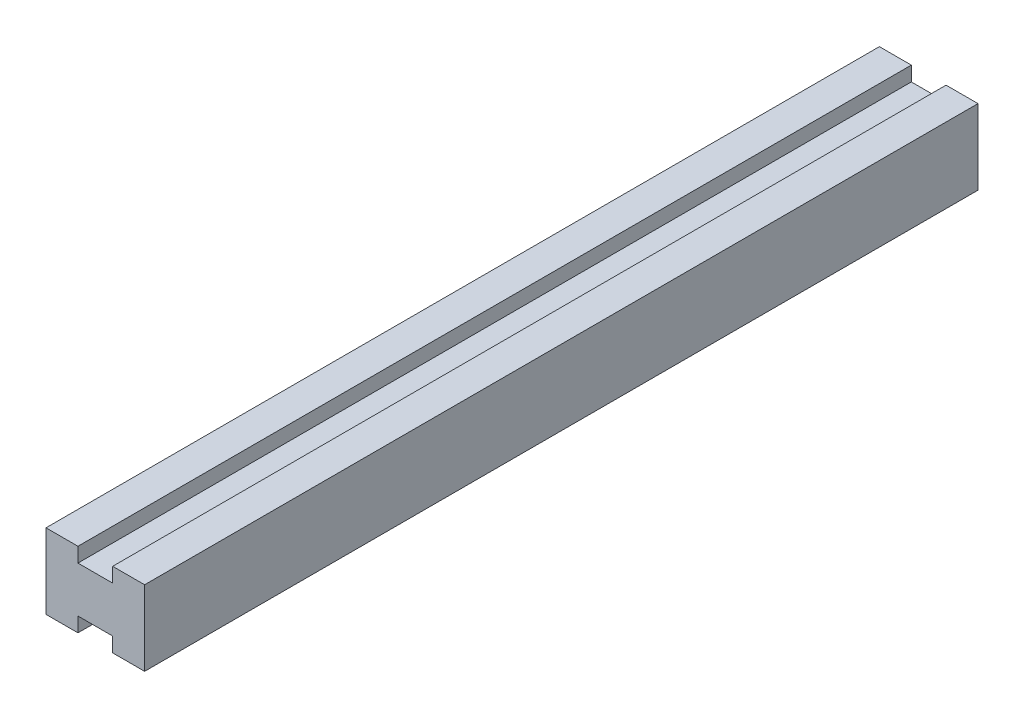
ISO-10303-21;
HEADER;
FILE_DESCRIPTION(('STEP AP214'),'2;1');
FILE_NAME('part.step','',(''),(''),'','','');
FILE_SCHEMA(('AUTOMOTIVE_DESIGN { 1 0 10303 214 1 1 1 1 }'));
ENDSEC;
DATA;
#1=APPLICATION_CONTEXT('core data for automotive mechanical design processes');
#2=APPLICATION_PROTOCOL_DEFINITION('international standard','automotive_design',2000,#1);
#3=PRODUCT_CONTEXT('',#1,'mechanical');
#4=PRODUCT('Part','Part','',(#3));
#5=PRODUCT_RELATED_PRODUCT_CATEGORY('part','',(#4));
#6=PRODUCT_DEFINITION_FORMATION('','',#4);
#7=PRODUCT_DEFINITION_CONTEXT('part definition',#1,'design');
#8=PRODUCT_DEFINITION('design','',#6,#7);
#9=PRODUCT_DEFINITION_SHAPE('','',#8);
#10=(LENGTH_UNIT() NAMED_UNIT(*) SI_UNIT(.MILLI.,.METRE.));
#11=(NAMED_UNIT(*) PLANE_ANGLE_UNIT() SI_UNIT($,.RADIAN.));
#12=(NAMED_UNIT(*) SI_UNIT($,.STERADIAN.) SOLID_ANGLE_UNIT());
#13=UNCERTAINTY_MEASURE_WITH_UNIT(LENGTH_MEASURE(1.E-05),#10,'distance_accuracy_value','');
#14=(GEOMETRIC_REPRESENTATION_CONTEXT(3) GLOBAL_UNCERTAINTY_ASSIGNED_CONTEXT((#13)) GLOBAL_UNIT_ASSIGNED_CONTEXT((#10,
#11,#12)) REPRESENTATION_CONTEXT('',''));
#15=CARTESIAN_POINT('',(0.,0.,0.));
#16=DIRECTION('',(0.,0.,1.));
#17=DIRECTION('',(1.,0.,0.));
#18=AXIS2_PLACEMENT_3D('',#15,#16,#17);
#19=CARTESIAN_POINT('',(-1.30000000000003,2.75,60.));
#20=DIRECTION('',(1.,0.,0.));
#21=DIRECTION('',(0.,0.,-1.));
#22=AXIS2_PLACEMENT_3D('',#19,#20,#21);
#23=PLANE('',#22);
#24=DIRECTION('',(0.,-1.,0.));
#25=VECTOR('',#24,1.);
#26=CARTESIAN_POINT('',(-1.30000000000003,2.75,0.));
#27=LINE('',#26,#25);
#28=CARTESIAN_POINT('',(-1.30000000000003,2.75,0.));
#29=VERTEX_POINT('',#28);
#30=CARTESIAN_POINT('',(-1.30000000000003,1.70000000000001,0.));
#31=VERTEX_POINT('',#30);
#32=EDGE_CURVE('E155',#29,#31,#27,.T.);
#33=ORIENTED_EDGE('',*,*,#32,.F.);
#34=DIRECTION('',(0.,0.,-1.));
#35=VECTOR('',#34,1.);
#36=CARTESIAN_POINT('',(-1.30000000000003,2.75,60.));
#37=LINE('',#36,#35);
#38=CARTESIAN_POINT('',(-1.30000000000003,2.75,60.));
#39=VERTEX_POINT('',#38);
#40=EDGE_CURVE('E11',#39,#29,#37,.T.);
#41=ORIENTED_EDGE('',*,*,#40,.F.);
#42=DIRECTION('',(0.,-1.,0.));
#43=VECTOR('',#42,1.);
#44=CARTESIAN_POINT('',(-1.30000000000003,2.75,60.));
#45=LINE('',#44,#43);
#46=CARTESIAN_POINT('',(-1.30000000000003,1.70000000000001,60.));
#47=VERTEX_POINT('',#46);
#48=EDGE_CURVE('E183',#39,#47,#45,.T.);
#49=ORIENTED_EDGE('',*,*,#48,.T.);
#50=DIRECTION('',(0.,0.,-1.));
#51=VECTOR('',#50,1.);
#52=CARTESIAN_POINT('',(-1.30000000000003,1.70000000000001,60.));
#53=LINE('',#52,#51);
#54=EDGE_CURVE('E36',#47,#31,#53,.T.);
#55=ORIENTED_EDGE('',*,*,#54,.T.);
#56=EDGE_LOOP('',(#33,#41,#49,#55));
#57=FACE_BOUND('',#56,.T.);
#58=ADVANCED_FACE('F33',(#57),#23,.T.);
#59=CARTESIAN_POINT('',(-1.30000000000003,2.75,60.));
#60=DIRECTION('',(0.,-1.,0.));
#61=DIRECTION('',(1.,0.,0.));
#62=AXIS2_PLACEMENT_3D('',#59,#60,#61);
#63=PLANE('',#62);
#64=DIRECTION('',(-1.,0.,0.));
#65=VECTOR('',#64,1.);
#66=CARTESIAN_POINT('',(-1.30000000000003,2.75,0.));
#67=LINE('',#66,#65);
#68=CARTESIAN_POINT('',(-3.60000000000001,2.75,0.));
#69=VERTEX_POINT('',#68);
#70=EDGE_CURVE('E90',#29,#69,#67,.T.);
#71=ORIENTED_EDGE('',*,*,#70,.T.);
#72=DIRECTION('',(0.,0.,-1.));
#73=VECTOR('',#72,1.);
#74=CARTESIAN_POINT('',(-3.60000000000001,2.75,60.));
#75=LINE('',#74,#73);
#76=CARTESIAN_POINT('',(-3.60000000000001,2.75,60.));
#77=VERTEX_POINT('',#76);
#78=EDGE_CURVE('E42',#77,#69,#75,.T.);
#79=ORIENTED_EDGE('',*,*,#78,.F.);
#80=DIRECTION('',(-1.,0.,0.));
#81=VECTOR('',#80,1.);
#82=CARTESIAN_POINT('',(-1.30000000000003,2.75,60.));
#83=LINE('',#82,#81);
#84=EDGE_CURVE('E134',#39,#77,#83,.T.);
#85=ORIENTED_EDGE('',*,*,#84,.F.);
#86=ORIENTED_EDGE('',*,*,#40,.T.);
#87=EDGE_LOOP('',(#71,#79,#85,#86));
#88=FACE_BOUND('',#87,.T.);
#89=ADVANCED_FACE('F260',(#88),#63,.F.);
#90=CARTESIAN_POINT('',(-3.60000000000001,2.75,60.));
#91=DIRECTION('',(1.,0.,0.));
#92=DIRECTION('',(0.,0.,-1.));
#93=AXIS2_PLACEMENT_3D('',#90,#91,#92);
#94=PLANE('',#93);
#95=DIRECTION('',(0.,-1.,0.));
#96=VECTOR('',#95,1.);
#97=CARTESIAN_POINT('',(-3.60000000000001,2.75,0.));
#98=LINE('',#97,#96);
#99=CARTESIAN_POINT('',(-3.60000000000001,-2.65,0.));
#100=VERTEX_POINT('',#99);
#101=EDGE_CURVE('E141',#69,#100,#98,.T.);
#102=ORIENTED_EDGE('',*,*,#101,.T.);
#103=DIRECTION('',(0.,0.,-1.));
#104=VECTOR('',#103,1.);
#105=CARTESIAN_POINT('',(-3.60000000000001,-2.65,60.));
#106=LINE('',#105,#104);
#107=CARTESIAN_POINT('',(-3.60000000000001,-2.65,60.));
#108=VERTEX_POINT('',#107);
#109=EDGE_CURVE('E138',#108,#100,#106,.T.);
#110=ORIENTED_EDGE('',*,*,#109,.F.);
#111=DIRECTION('',(0.,-1.,0.));
#112=VECTOR('',#111,1.);
#113=CARTESIAN_POINT('',(-3.60000000000001,2.75,60.));
#114=LINE('',#113,#112);
#115=EDGE_CURVE('E127',#77,#108,#114,.T.);
#116=ORIENTED_EDGE('',*,*,#115,.F.);
#117=ORIENTED_EDGE('',*,*,#78,.T.);
#118=EDGE_LOOP('',(#102,#110,#116,#117));
#119=FACE_BOUND('',#118,.T.);
#120=ADVANCED_FACE('F139',(#119),#94,.F.);
#121=CARTESIAN_POINT('',(-1.30000000000003,-2.65,60.));
#122=DIRECTION('',(0.,-1.,0.));
#123=DIRECTION('',(1.,0.,0.));
#124=AXIS2_PLACEMENT_3D('',#121,#122,#123);
#125=PLANE('',#124);
#126=DIRECTION('',(-1.,0.,0.));
#127=VECTOR('',#126,1.);
#128=CARTESIAN_POINT('',(-1.30000000000003,-2.65,0.));
#129=LINE('',#128,#127);
#130=CARTESIAN_POINT('',(-1.30000000000003,-2.65,0.));
#131=VERTEX_POINT('',#130);
#132=EDGE_CURVE('E180',#131,#100,#129,.T.);
#133=ORIENTED_EDGE('',*,*,#132,.F.);
#134=DIRECTION('',(0.,0.,-1.));
#135=VECTOR('',#134,1.);
#136=CARTESIAN_POINT('',(-1.30000000000003,-2.65,60.));
#137=LINE('',#136,#135);
#138=CARTESIAN_POINT('',(-1.30000000000003,-2.65,60.));
#139=VERTEX_POINT('',#138);
#140=EDGE_CURVE('E145',#139,#131,#137,.T.);
#141=ORIENTED_EDGE('',*,*,#140,.F.);
#142=DIRECTION('',(-1.,0.,0.));
#143=VECTOR('',#142,1.);
#144=CARTESIAN_POINT('',(-1.30000000000003,-2.65,60.));
#145=LINE('',#144,#143);
#146=EDGE_CURVE('E132',#139,#108,#145,.T.);
#147=ORIENTED_EDGE('',*,*,#146,.T.);
#148=ORIENTED_EDGE('',*,*,#109,.T.);
#149=EDGE_LOOP('',(#133,#141,#147,#148));
#150=FACE_BOUND('',#149,.T.);
#151=ADVANCED_FACE('F147',(#150),#125,.T.);
#152=CARTESIAN_POINT('',(-1.30000000000003,-1.6,60.));
#153=DIRECTION('',(1.,0.,0.));
#154=DIRECTION('',(0.,1.,0.));
#155=AXIS2_PLACEMENT_3D('',#152,#153,#154);
#156=PLANE('',#155);
#157=DIRECTION('',(0.,-1.,0.));
#158=VECTOR('',#157,1.);
#159=CARTESIAN_POINT('',(-1.30000000000003,-1.6,0.));
#160=LINE('',#159,#158);
#161=CARTESIAN_POINT('',(-1.30000000000003,-1.6,0.));
#162=VERTEX_POINT('',#161);
#163=EDGE_CURVE('E177',#162,#131,#160,.T.);
#164=ORIENTED_EDGE('',*,*,#163,.F.);
#165=DIRECTION('',(0.,0.,-1.));
#166=VECTOR('',#165,1.);
#167=CARTESIAN_POINT('',(-1.30000000000003,-1.6,60.));
#168=LINE('',#167,#166);
#169=CARTESIAN_POINT('',(-1.30000000000003,-1.6,60.));
#170=VERTEX_POINT('',#169);
#171=EDGE_CURVE('E187',#170,#162,#168,.T.);
#172=ORIENTED_EDGE('',*,*,#171,.F.);
#173=DIRECTION('',(0.,-1.,0.));
#174=VECTOR('',#173,1.);
#175=CARTESIAN_POINT('',(-1.30000000000003,-1.6,60.));
#176=LINE('',#175,#174);
#177=EDGE_CURVE('E148',#170,#139,#176,.T.);
#178=ORIENTED_EDGE('',*,*,#177,.T.);
#179=ORIENTED_EDGE('',*,*,#140,.T.);
#180=EDGE_LOOP('',(#164,#172,#178,#179));
#181=FACE_BOUND('',#180,.T.);
#182=ADVANCED_FACE('F212',(#181),#156,.T.);
#183=CARTESIAN_POINT('',(1.19999999999997,-1.60000000000001,60.));
#184=DIRECTION('',(0.,-1.,0.));
#185=DIRECTION('',(1.,0.,0.));
#186=AXIS2_PLACEMENT_3D('',#183,#184,#185);
#187=PLANE('',#186);
#188=DIRECTION('',(-1.,0.,0.));
#189=VECTOR('',#188,1.);
#190=CARTESIAN_POINT('',(1.19999999999997,-1.60000000000001,0.));
#191=LINE('',#190,#189);
#192=CARTESIAN_POINT('',(1.19999999999997,-1.60000000000001,0.));
#193=VERTEX_POINT('',#192);
#194=EDGE_CURVE('E174',#193,#162,#191,.T.);
#195=ORIENTED_EDGE('',*,*,#194,.F.);
#196=DIRECTION('',(0.,0.,-1.));
#197=VECTOR('',#196,1.);
#198=CARTESIAN_POINT('',(1.19999999999997,-1.60000000000001,60.));
#199=LINE('',#198,#197);
#200=CARTESIAN_POINT('',(1.19999999999997,-1.60000000000001,60.));
#201=VERTEX_POINT('',#200);
#202=EDGE_CURVE('E189',#201,#193,#199,.T.);
#203=ORIENTED_EDGE('',*,*,#202,.F.);
#204=DIRECTION('',(-1.,0.,0.));
#205=VECTOR('',#204,1.);
#206=CARTESIAN_POINT('',(1.19999999999997,-1.60000000000001,60.));
#207=LINE('',#206,#205);
#208=EDGE_CURVE('E150',#201,#170,#207,.T.);
#209=ORIENTED_EDGE('',*,*,#208,.T.);
#210=ORIENTED_EDGE('',*,*,#171,.T.);
#211=EDGE_LOOP('',(#195,#203,#209,#210));
#212=FACE_BOUND('',#211,.T.);
#213=ADVANCED_FACE('F216',(#212),#187,.T.);
#214=CARTESIAN_POINT('',(1.19999999999997,-1.60000000000001,60.));
#215=DIRECTION('',(1.,0.,0.));
#216=DIRECTION('',(0.,0.,-1.));
#217=AXIS2_PLACEMENT_3D('',#214,#215,#216);
#218=PLANE('',#217);
#219=DIRECTION('',(0.,-1.,0.));
#220=VECTOR('',#219,1.);
#221=CARTESIAN_POINT('',(1.19999999999997,-1.60000000000001,0.));
#222=LINE('',#221,#220);
#223=CARTESIAN_POINT('',(1.19999999999997,-2.65,0.));
#224=VERTEX_POINT('',#223);
#225=EDGE_CURVE('E172',#193,#224,#222,.T.);
#226=ORIENTED_EDGE('',*,*,#225,.T.);
#227=DIRECTION('',(0.,0.,-1.));
#228=VECTOR('',#227,1.);
#229=CARTESIAN_POINT('',(1.19999999999997,-2.65,60.));
#230=LINE('',#229,#228);
#231=CARTESIAN_POINT('',(1.19999999999997,-2.65,60.));
#232=VERTEX_POINT('',#231);
#233=EDGE_CURVE('E191',#232,#224,#230,.T.);
#234=ORIENTED_EDGE('',*,*,#233,.F.);
#235=DIRECTION('',(0.,-1.,0.));
#236=VECTOR('',#235,1.);
#237=CARTESIAN_POINT('',(1.19999999999997,-1.60000000000001,60.));
#238=LINE('',#237,#236);
#239=EDGE_CURVE('E218',#201,#232,#238,.T.);
#240=ORIENTED_EDGE('',*,*,#239,.F.);
#241=ORIENTED_EDGE('',*,*,#202,.T.);
#242=EDGE_LOOP('',(#226,#234,#240,#241));
#243=FACE_BOUND('',#242,.T.);
#244=ADVANCED_FACE('F250',(#243),#218,.F.);
#245=CARTESIAN_POINT('',(1.19999999999997,-2.65,60.));
#246=DIRECTION('',(0.,1.,0.));
#247=DIRECTION('',(0.,0.,1.));
#248=AXIS2_PLACEMENT_3D('',#245,#246,#247);
#249=PLANE('',#248);
#250=DIRECTION('',(1.,0.,0.));
#251=VECTOR('',#250,1.);
#252=CARTESIAN_POINT('',(1.19999999999997,-2.65,0.));
#253=LINE('',#252,#251);
#254=CARTESIAN_POINT('',(3.49999999999996,-2.65,0.));
#255=VERTEX_POINT('',#254);
#256=EDGE_CURVE('E169',#224,#255,#253,.T.);
#257=ORIENTED_EDGE('',*,*,#256,.T.);
#258=DIRECTION('',(0.,0.,-1.));
#259=VECTOR('',#258,1.);
#260=CARTESIAN_POINT('',(3.49999999999996,-2.65,60.));
#261=LINE('',#260,#259);
#262=CARTESIAN_POINT('',(3.49999999999996,-2.65,60.));
#263=VERTEX_POINT('',#262);
#264=EDGE_CURVE('E194',#263,#255,#261,.T.);
#265=ORIENTED_EDGE('',*,*,#264,.F.);
#266=DIRECTION('',(1.,0.,0.));
#267=VECTOR('',#266,1.);
#268=CARTESIAN_POINT('',(1.19999999999997,-2.65,60.));
#269=LINE('',#268,#267);
#270=EDGE_CURVE('E219',#232,#263,#269,.T.);
#271=ORIENTED_EDGE('',*,*,#270,.F.);
#272=ORIENTED_EDGE('',*,*,#233,.T.);
#273=EDGE_LOOP('',(#257,#265,#271,#272));
#274=FACE_BOUND('',#273,.T.);
#275=ADVANCED_FACE('F246',(#274),#249,.F.);
#276=CARTESIAN_POINT('',(3.49999999999996,2.75,60.));
#277=DIRECTION('',(1.,0.,0.));
#278=DIRECTION('',(0.,1.,0.));
#279=AXIS2_PLACEMENT_3D('',#276,#277,#278);
#280=PLANE('',#279);
#281=DIRECTION('',(0.,-1.,0.));
#282=VECTOR('',#281,1.);
#283=CARTESIAN_POINT('',(3.49999999999996,2.75,0.));
#284=LINE('',#283,#282);
#285=CARTESIAN_POINT('',(3.49999999999996,2.75,0.));
#286=VERTEX_POINT('',#285);
#287=EDGE_CURVE('E166',#286,#255,#284,.T.);
#288=ORIENTED_EDGE('',*,*,#287,.F.);
#289=DIRECTION('',(0.,0.,-1.));
#290=VECTOR('',#289,1.);
#291=CARTESIAN_POINT('',(3.49999999999996,2.75,60.));
#292=LINE('',#291,#290);
#293=CARTESIAN_POINT('',(3.49999999999996,2.75,60.));
#294=VERTEX_POINT('',#293);
#295=EDGE_CURVE('E196',#294,#286,#292,.T.);
#296=ORIENTED_EDGE('',*,*,#295,.F.);
#297=DIRECTION('',(0.,-1.,0.));
#298=VECTOR('',#297,1.);
#299=CARTESIAN_POINT('',(3.49999999999996,2.75,60.));
#300=LINE('',#299,#298);
#301=EDGE_CURVE('E223',#294,#263,#300,.T.);
#302=ORIENTED_EDGE('',*,*,#301,.T.);
#303=ORIENTED_EDGE('',*,*,#264,.T.);
#304=EDGE_LOOP('',(#288,#296,#302,#303));
#305=FACE_BOUND('',#304,.T.);
#306=ADVANCED_FACE('F242',(#305),#280,.T.);
#307=CARTESIAN_POINT('',(1.19999999999997,2.75,60.));
#308=DIRECTION('',(0.,1.,0.));
#309=DIRECTION('',(-1.,0.,0.));
#310=AXIS2_PLACEMENT_3D('',#307,#308,#309);
#311=PLANE('',#310);
#312=DIRECTION('',(1.,0.,0.));
#313=VECTOR('',#312,1.);
#314=CARTESIAN_POINT('',(1.19999999999997,2.75,0.));
#315=LINE('',#314,#313);
#316=CARTESIAN_POINT('',(1.19999999999997,2.75,0.));
#317=VERTEX_POINT('',#316);
#318=EDGE_CURVE('E163',#317,#286,#315,.T.);
#319=ORIENTED_EDGE('',*,*,#318,.F.);
#320=DIRECTION('',(0.,0.,-1.));
#321=VECTOR('',#320,1.);
#322=CARTESIAN_POINT('',(1.19999999999997,2.75,60.));
#323=LINE('',#322,#321);
#324=CARTESIAN_POINT('',(1.19999999999997,2.75,60.));
#325=VERTEX_POINT('',#324);
#326=EDGE_CURVE('E198',#325,#317,#323,.T.);
#327=ORIENTED_EDGE('',*,*,#326,.F.);
#328=DIRECTION('',(1.,0.,0.));
#329=VECTOR('',#328,1.);
#330=CARTESIAN_POINT('',(1.19999999999997,2.75,60.));
#331=LINE('',#330,#329);
#332=EDGE_CURVE('E226',#325,#294,#331,.T.);
#333=ORIENTED_EDGE('',*,*,#332,.T.);
#334=ORIENTED_EDGE('',*,*,#295,.T.);
#335=EDGE_LOOP('',(#319,#327,#333,#334));
#336=FACE_BOUND('',#335,.T.);
#337=ADVANCED_FACE('F239',(#336),#311,.T.);
#338=CARTESIAN_POINT('',(1.19999999999997,2.75,60.));
#339=DIRECTION('',(1.,0.,0.));
#340=DIRECTION('',(0.,1.,0.));
#341=AXIS2_PLACEMENT_3D('',#338,#339,#340);
#342=PLANE('',#341);
#343=DIRECTION('',(0.,-1.,0.));
#344=VECTOR('',#343,1.);
#345=CARTESIAN_POINT('',(1.19999999999997,2.75,0.));
#346=LINE('',#345,#344);
#347=CARTESIAN_POINT('',(1.19999999999997,1.70000000000001,0.));
#348=VERTEX_POINT('',#347);
#349=EDGE_CURVE('E161',#317,#348,#346,.T.);
#350=ORIENTED_EDGE('',*,*,#349,.T.);
#351=DIRECTION('',(0.,0.,-1.));
#352=VECTOR('',#351,1.);
#353=CARTESIAN_POINT('',(1.19999999999997,1.70000000000001,60.));
#354=LINE('',#353,#352);
#355=CARTESIAN_POINT('',(1.19999999999997,1.70000000000001,60.));
#356=VERTEX_POINT('',#355);
#357=EDGE_CURVE('E199',#356,#348,#354,.T.);
#358=ORIENTED_EDGE('',*,*,#357,.F.);
#359=DIRECTION('',(0.,-1.,0.));
#360=VECTOR('',#359,1.);
#361=CARTESIAN_POINT('',(1.19999999999997,2.75,60.));
#362=LINE('',#361,#360);
#363=EDGE_CURVE('E229',#325,#356,#362,.T.);
#364=ORIENTED_EDGE('',*,*,#363,.F.);
#365=ORIENTED_EDGE('',*,*,#326,.T.);
#366=EDGE_LOOP('',(#350,#358,#364,#365));
#367=FACE_BOUND('',#366,.T.);
#368=ADVANCED_FACE('F236',(#367),#342,.F.);
#369=CARTESIAN_POINT('',(1.19999999999997,1.70000000000001,60.));
#370=DIRECTION('',(0.,-1.,0.));
#371=DIRECTION('',(1.,0.,0.));
#372=AXIS2_PLACEMENT_3D('',#369,#370,#371);
#373=PLANE('',#372);
#374=DIRECTION('',(-1.,0.,0.));
#375=VECTOR('',#374,1.);
#376=CARTESIAN_POINT('',(1.19999999999997,1.70000000000001,0.));
#377=LINE('',#376,#375);
#378=EDGE_CURVE('E158',#348,#31,#377,.T.);
#379=ORIENTED_EDGE('',*,*,#378,.T.);
#380=ORIENTED_EDGE('',*,*,#54,.F.);
#381=DIRECTION('',(-1.,0.,0.));
#382=VECTOR('',#381,1.);
#383=CARTESIAN_POINT('',(1.19999999999997,1.70000000000001,60.));
#384=LINE('',#383,#382);
#385=EDGE_CURVE('E100',#356,#47,#384,.T.);
#386=ORIENTED_EDGE('',*,*,#385,.F.);
#387=ORIENTED_EDGE('',*,*,#357,.T.);
#388=EDGE_LOOP('',(#379,#380,#386,#387));
#389=FACE_BOUND('',#388,.T.);
#390=ADVANCED_FACE('F204',(#389),#373,.F.);
#391=CARTESIAN_POINT('',(0.,0.,60.));
#392=DIRECTION('',(0.,0.,-1.));
#393=DIRECTION('',(-1.,0.,0.));
#394=AXIS2_PLACEMENT_3D('',#391,#392,#393);
#395=PLANE('',#394);
#396=ORIENTED_EDGE('',*,*,#48,.F.);
#397=ORIENTED_EDGE('',*,*,#84,.T.);
#398=ORIENTED_EDGE('',*,*,#115,.T.);
#399=ORIENTED_EDGE('',*,*,#146,.F.);
#400=ORIENTED_EDGE('',*,*,#177,.F.);
#401=ORIENTED_EDGE('',*,*,#208,.F.);
#402=ORIENTED_EDGE('',*,*,#239,.T.);
#403=ORIENTED_EDGE('',*,*,#270,.T.);
#404=ORIENTED_EDGE('',*,*,#301,.F.);
#405=ORIENTED_EDGE('',*,*,#332,.F.);
#406=ORIENTED_EDGE('',*,*,#363,.T.);
#407=ORIENTED_EDGE('',*,*,#385,.T.);
#408=EDGE_LOOP('',(#396,#397,#398,#399,#400,#401,#402,#403,#404,#405,#406,#407));
#409=FACE_BOUND('',#408,.T.);
#410=ADVANCED_FACE('F129',(#409),#395,.F.);
#411=CARTESIAN_POINT('',(0.,0.,0.));
#412=DIRECTION('',(0.,0.,-1.));
#413=DIRECTION('',(-1.,0.,0.));
#414=AXIS2_PLACEMENT_3D('',#411,#412,#413);
#415=PLANE('',#414);
#416=ORIENTED_EDGE('',*,*,#32,.T.);
#417=ORIENTED_EDGE('',*,*,#378,.F.);
#418=ORIENTED_EDGE('',*,*,#349,.F.);
#419=ORIENTED_EDGE('',*,*,#318,.T.);
#420=ORIENTED_EDGE('',*,*,#287,.T.);
#421=ORIENTED_EDGE('',*,*,#256,.F.);
#422=ORIENTED_EDGE('',*,*,#225,.F.);
#423=ORIENTED_EDGE('',*,*,#194,.T.);
#424=ORIENTED_EDGE('',*,*,#163,.T.);
#425=ORIENTED_EDGE('',*,*,#132,.T.);
#426=ORIENTED_EDGE('',*,*,#101,.F.);
#427=ORIENTED_EDGE('',*,*,#70,.F.);
#428=EDGE_LOOP('',(#416,#417,#418,#419,#420,#421,#422,#423,#424,#425,#426,#427));
#429=FACE_BOUND('',#428,.T.);
#430=ADVANCED_FACE('F207',(#429),#415,.T.);
#431=CLOSED_SHELL('',(#58,#89,#120,#151,#182,#213,#244,#275,#306,#337,#368,#390,#410,#430));
#432=MANIFOLD_SOLID_BREP('B2',#431);
#433=ADVANCED_BREP_SHAPE_REPRESENTATION('',(#18,#432),#14);
#434=SHAPE_DEFINITION_REPRESENTATION(#9,#433);
ENDSEC;
END-ISO-10303-21;
